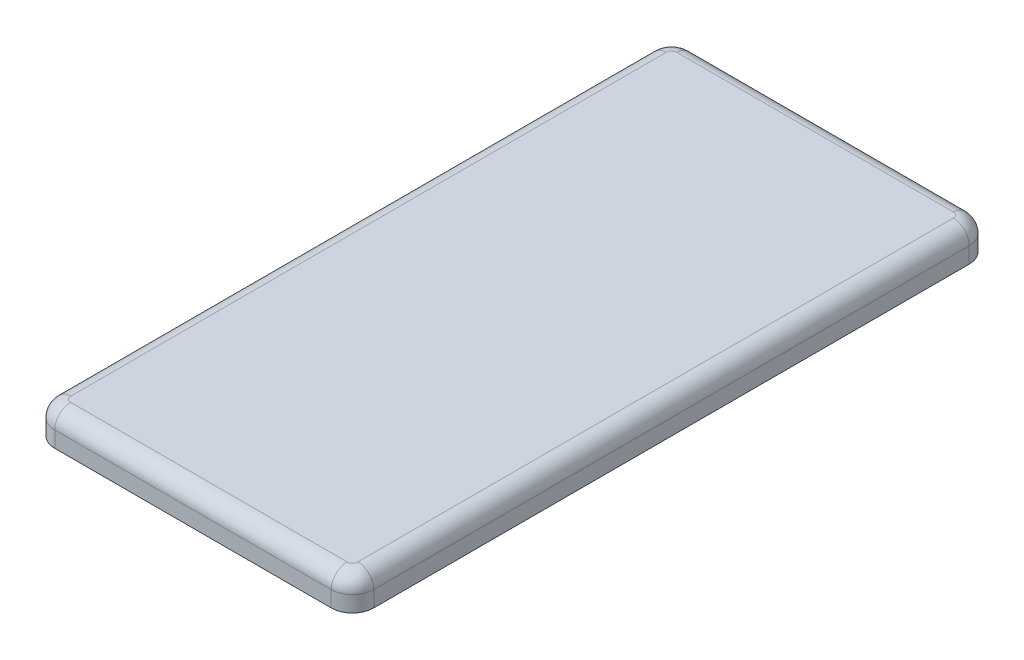
ISO-10303-21;
HEADER;
FILE_DESCRIPTION(('STEP AP214'),'2;1');
FILE_NAME('part.step','',(''),(''),'','','');
FILE_SCHEMA(('AUTOMOTIVE_DESIGN { 1 0 10303 214 1 1 1 1 }'));
ENDSEC;
DATA;
#1=APPLICATION_CONTEXT('core data for automotive mechanical design processes');
#2=APPLICATION_PROTOCOL_DEFINITION('international standard','automotive_design',2000,#1);
#3=PRODUCT_CONTEXT('',#1,'mechanical');
#4=PRODUCT('Part','Part','',(#3));
#5=PRODUCT_RELATED_PRODUCT_CATEGORY('part','',(#4));
#6=PRODUCT_DEFINITION_FORMATION('','',#4);
#7=PRODUCT_DEFINITION_CONTEXT('part definition',#1,'design');
#8=PRODUCT_DEFINITION('design','',#6,#7);
#9=PRODUCT_DEFINITION_SHAPE('','',#8);
#10=(LENGTH_UNIT() NAMED_UNIT(*) SI_UNIT(.MILLI.,.METRE.));
#11=(NAMED_UNIT(*) PLANE_ANGLE_UNIT() SI_UNIT($,.RADIAN.));
#12=(NAMED_UNIT(*) SI_UNIT($,.STERADIAN.) SOLID_ANGLE_UNIT());
#13=UNCERTAINTY_MEASURE_WITH_UNIT(LENGTH_MEASURE(1.E-05),#10,'distance_accuracy_value','');
#14=(GEOMETRIC_REPRESENTATION_CONTEXT(3) GLOBAL_UNCERTAINTY_ASSIGNED_CONTEXT((#13)) GLOBAL_UNIT_ASSIGNED_CONTEXT((#10,
#11,#12)) REPRESENTATION_CONTEXT('',''));
#15=CARTESIAN_POINT('',(0.,0.,0.));
#16=DIRECTION('',(0.,0.,1.));
#17=DIRECTION('',(1.,0.,0.));
#18=AXIS2_PLACEMENT_3D('',#15,#16,#17);
#19=CARTESIAN_POINT('',(-13.,0.,30.));
#20=DIRECTION('',(0.,0.,1.));
#21=DIRECTION('',(1.,0.,0.));
#22=AXIS2_PLACEMENT_3D('',#19,#20,#21);
#23=PLANE('',#22);
#24=DIRECTION('',(1.,0.,0.));
#25=VECTOR('',#24,1.);
#26=CARTESIAN_POINT('',(-6.5,0.,30.));
#27=LINE('',#26,#25);
#28=CARTESIAN_POINT('',(-13.,0.,30.));
#29=VERTEX_POINT('',#28);
#30=CARTESIAN_POINT('',(13.,0.,30.));
#31=VERTEX_POINT('',#30);
#32=EDGE_CURVE('E141',#29,#31,#27,.T.);
#33=ORIENTED_EDGE('',*,*,#32,.F.);
#34=DIRECTION('',(0.,-1.,0.));
#35=VECTOR('',#34,1.);
#36=CARTESIAN_POINT('',(-13.,0.,30.));
#37=LINE('',#36,#35);
#38=CARTESIAN_POINT('',(-13.,-1.5,30.));
#39=VERTEX_POINT('',#38);
#40=EDGE_CURVE('E143',#29,#39,#37,.T.);
#41=ORIENTED_EDGE('',*,*,#40,.T.);
#42=DIRECTION('',(-1.,0.,0.));
#43=VECTOR('',#42,1.);
#44=CARTESIAN_POINT('',(-13.,-1.5,30.));
#45=LINE('',#44,#43);
#46=CARTESIAN_POINT('',(13.,-1.5,30.));
#47=VERTEX_POINT('',#46);
#48=EDGE_CURVE('E169',#47,#39,#45,.T.);
#49=ORIENTED_EDGE('',*,*,#48,.F.);
#50=DIRECTION('',(0.,1.,0.));
#51=VECTOR('',#50,1.);
#52=CARTESIAN_POINT('',(13.,0.,30.));
#53=LINE('',#52,#51);
#54=EDGE_CURVE('E10',#47,#31,#53,.T.);
#55=ORIENTED_EDGE('',*,*,#54,.T.);
#56=EDGE_LOOP('',(#33,#41,#49,#55));
#57=FACE_BOUND('',#56,.T.);
#58=ADVANCED_FACE('F16',(#57),#23,.T.);
#59=CARTESIAN_POINT('',(13.,0.,28.));
#60=DIRECTION('',(0.,-1.,0.));
#61=DIRECTION('',(0.,0.,1.));
#62=AXIS2_PLACEMENT_3D('',#59,#60,#61);
#63=CYLINDRICAL_SURFACE('',#62,2.);
#64=CARTESIAN_POINT('',(13.,0.,28.));
#65=DIRECTION('',(0.,1.,0.));
#66=DIRECTION('',(0.707106781186548,0.,0.707106781186548));
#67=AXIS2_PLACEMENT_3D('',#64,#65,#66);
#68=CIRCLE('',#67,2.);
#69=CARTESIAN_POINT('',(15.,0.,28.));
#70=VERTEX_POINT('',#69);
#71=EDGE_CURVE('E117',#31,#70,#68,.T.);
#72=ORIENTED_EDGE('',*,*,#71,.F.);
#73=ORIENTED_EDGE('',*,*,#54,.F.);
#74=CARTESIAN_POINT('',(13.,-1.5,28.));
#75=DIRECTION('',(0.,-1.,0.));
#76=DIRECTION('',(0.,0.,1.));
#77=AXIS2_PLACEMENT_3D('',#74,#75,#76);
#78=CIRCLE('',#77,2.);
#79=CARTESIAN_POINT('',(15.,-1.5,28.));
#80=VERTEX_POINT('',#79);
#81=EDGE_CURVE('E187',#80,#47,#78,.T.);
#82=ORIENTED_EDGE('',*,*,#81,.F.);
#83=DIRECTION('',(0.,1.,0.));
#84=VECTOR('',#83,1.);
#85=CARTESIAN_POINT('',(15.,0.,28.));
#86=LINE('',#85,#84);
#87=EDGE_CURVE('E27',#80,#70,#86,.T.);
#88=ORIENTED_EDGE('',*,*,#87,.T.);
#89=EDGE_LOOP('',(#72,#73,#82,#88));
#90=FACE_BOUND('',#89,.T.);
#91=ADVANCED_FACE('F244',(#90),#63,.T.);
#92=CARTESIAN_POINT('',(15.,0.,28.));
#93=DIRECTION('',(1.,0.,0.));
#94=DIRECTION('',(0.,0.,-1.));
#95=AXIS2_PLACEMENT_3D('',#92,#93,#94);
#96=PLANE('',#95);
#97=DIRECTION('',(0.,0.,-1.));
#98=VECTOR('',#97,1.);
#99=CARTESIAN_POINT('',(15.,0.,14.));
#100=LINE('',#99,#98);
#101=CARTESIAN_POINT('',(15.,0.,-28.));
#102=VERTEX_POINT('',#101);
#103=EDGE_CURVE('E116',#70,#102,#100,.T.);
#104=ORIENTED_EDGE('',*,*,#103,.F.);
#105=ORIENTED_EDGE('',*,*,#87,.F.);
#106=DIRECTION('',(0.,0.,1.));
#107=VECTOR('',#106,1.);
#108=CARTESIAN_POINT('',(15.,-1.5,28.));
#109=LINE('',#108,#107);
#110=CARTESIAN_POINT('',(15.,-1.5,-28.));
#111=VERTEX_POINT('',#110);
#112=EDGE_CURVE('E168',#111,#80,#109,.T.);
#113=ORIENTED_EDGE('',*,*,#112,.F.);
#114=DIRECTION('',(0.,1.,0.));
#115=VECTOR('',#114,1.);
#116=CARTESIAN_POINT('',(15.,0.,-28.));
#117=LINE('',#116,#115);
#118=EDGE_CURVE('E194',#111,#102,#117,.T.);
#119=ORIENTED_EDGE('',*,*,#118,.T.);
#120=EDGE_LOOP('',(#104,#105,#113,#119));
#121=FACE_BOUND('',#120,.T.);
#122=ADVANCED_FACE('F291',(#121),#96,.T.);
#123=CARTESIAN_POINT('',(-13.,0.,28.));
#124=DIRECTION('',(0.,-1.,0.));
#125=DIRECTION('',(-1.,0.,0.));
#126=AXIS2_PLACEMENT_3D('',#123,#124,#125);
#127=CYLINDRICAL_SURFACE('',#126,2.);
#128=CARTESIAN_POINT('',(-13.,0.,28.));
#129=DIRECTION('',(0.,1.,0.));
#130=DIRECTION('',(-0.707106781186548,0.,0.707106781186548));
#131=AXIS2_PLACEMENT_3D('',#128,#129,#130);
#132=CIRCLE('',#131,2.);
#133=CARTESIAN_POINT('',(-15.,0.,28.));
#134=VERTEX_POINT('',#133);
#135=EDGE_CURVE('E184',#134,#29,#132,.T.);
#136=ORIENTED_EDGE('',*,*,#135,.F.);
#137=DIRECTION('',(0.,1.,0.));
#138=VECTOR('',#137,1.);
#139=CARTESIAN_POINT('',(-15.,0.,28.));
#140=LINE('',#139,#138);
#141=CARTESIAN_POINT('',(-15.,-1.5,28.));
#142=VERTEX_POINT('',#141);
#143=EDGE_CURVE('E136',#142,#134,#140,.T.);
#144=ORIENTED_EDGE('',*,*,#143,.F.);
#145=CARTESIAN_POINT('',(-13.,-1.5,28.));
#146=DIRECTION('',(0.,-1.,0.));
#147=DIRECTION('',(-1.,0.,0.));
#148=AXIS2_PLACEMENT_3D('',#145,#146,#147);
#149=CIRCLE('',#148,2.);
#150=EDGE_CURVE('E68',#39,#142,#149,.T.);
#151=ORIENTED_EDGE('',*,*,#150,.F.);
#152=ORIENTED_EDGE('',*,*,#40,.F.);
#153=EDGE_LOOP('',(#136,#144,#151,#152));
#154=FACE_BOUND('',#153,.T.);
#155=ADVANCED_FACE('F239',(#154),#127,.T.);
#156=CARTESIAN_POINT('',(0.,-1.5,0.));
#157=DIRECTION('',(0.,-1.,0.));
#158=DIRECTION('',(0.,0.,-1.));
#159=AXIS2_PLACEMENT_3D('',#156,#157,#158);
#160=PLANE('',#159);
#161=ORIENTED_EDGE('',*,*,#48,.T.);
#162=ORIENTED_EDGE('',*,*,#150,.T.);
#163=DIRECTION('',(0.,0.,-1.));
#164=VECTOR('',#163,1.);
#165=CARTESIAN_POINT('',(-15.,-1.5,-28.));
#166=LINE('',#165,#164);
#167=CARTESIAN_POINT('',(-15.,-1.5,-28.));
#168=VERTEX_POINT('',#167);
#169=EDGE_CURVE('E145',#142,#168,#166,.T.);
#170=ORIENTED_EDGE('',*,*,#169,.T.);
#171=CARTESIAN_POINT('',(-13.,-1.5,-28.));
#172=DIRECTION('',(0.,-1.,0.));
#173=DIRECTION('',(0.,0.,-1.));
#174=AXIS2_PLACEMENT_3D('',#171,#172,#173);
#175=CIRCLE('',#174,2.);
#176=CARTESIAN_POINT('',(-13.,-1.5,-30.));
#177=VERTEX_POINT('',#176);
#178=EDGE_CURVE('E78',#168,#177,#175,.T.);
#179=ORIENTED_EDGE('',*,*,#178,.T.);
#180=DIRECTION('',(1.,0.,0.));
#181=VECTOR('',#180,1.);
#182=CARTESIAN_POINT('',(13.,-1.5,-30.));
#183=LINE('',#182,#181);
#184=CARTESIAN_POINT('',(13.,-1.5,-30.));
#185=VERTEX_POINT('',#184);
#186=EDGE_CURVE('E197',#177,#185,#183,.T.);
#187=ORIENTED_EDGE('',*,*,#186,.T.);
#188=CARTESIAN_POINT('',(13.,-1.5,-28.));
#189=DIRECTION('',(0.,-1.,0.));
#190=DIRECTION('',(1.,0.,0.));
#191=AXIS2_PLACEMENT_3D('',#188,#189,#190);
#192=CIRCLE('',#191,2.);
#193=EDGE_CURVE('E196',#185,#111,#192,.T.);
#194=ORIENTED_EDGE('',*,*,#193,.T.);
#195=ORIENTED_EDGE('',*,*,#112,.T.);
#196=ORIENTED_EDGE('',*,*,#81,.T.);
#197=EDGE_LOOP('',(#161,#162,#170,#179,#187,#194,#195,#196));
#198=FACE_BOUND('',#197,.T.);
#199=ADVANCED_FACE('F241',(#198),#160,.T.);
#200=CARTESIAN_POINT('',(0.,1.5,0.));
#201=DIRECTION('',(0.,-1.,0.));
#202=DIRECTION('',(0.,0.,-1.));
#203=AXIS2_PLACEMENT_3D('',#200,#201,#202);
#204=PLANE('',#203);
#205=CARTESIAN_POINT('',(13.,1.5,-28.));
#206=DIRECTION('',(0.,-1.,0.));
#207=DIRECTION('',(0.707106781186547,0.,-0.707106781186548));
#208=AXIS2_PLACEMENT_3D('',#205,#206,#207);
#209=CIRCLE('',#208,0.500000000000006);
#210=CARTESIAN_POINT('',(13.,1.5,-28.5));
#211=VERTEX_POINT('',#210);
#212=CARTESIAN_POINT('',(13.5,1.5,-28.));
#213=VERTEX_POINT('',#212);
#214=EDGE_CURVE('E108',#211,#213,#209,.T.);
#215=ORIENTED_EDGE('',*,*,#214,.F.);
#216=DIRECTION('',(1.,0.,0.));
#217=VECTOR('',#216,1.);
#218=CARTESIAN_POINT('',(6.5,1.5,-28.5));
#219=LINE('',#218,#217);
#220=CARTESIAN_POINT('',(-13.,1.5,-28.5));
#221=VERTEX_POINT('',#220);
#222=EDGE_CURVE('E153',#221,#211,#219,.T.);
#223=ORIENTED_EDGE('',*,*,#222,.F.);
#224=CARTESIAN_POINT('',(-13.,1.5,-28.));
#225=DIRECTION('',(0.,-1.,0.));
#226=DIRECTION('',(-0.707106781186548,0.,-0.707106781186547));
#227=AXIS2_PLACEMENT_3D('',#224,#225,#226);
#228=CIRCLE('',#227,0.500000000000006);
#229=CARTESIAN_POINT('',(-13.5,1.5,-28.));
#230=VERTEX_POINT('',#229);
#231=EDGE_CURVE('E180',#230,#221,#228,.T.);
#232=ORIENTED_EDGE('',*,*,#231,.F.);
#233=DIRECTION('',(0.,0.,-1.));
#234=VECTOR('',#233,1.);
#235=CARTESIAN_POINT('',(-13.5,1.5,-14.));
#236=LINE('',#235,#234);
#237=CARTESIAN_POINT('',(-13.5,1.5,28.));
#238=VERTEX_POINT('',#237);
#239=EDGE_CURVE('E160',#238,#230,#236,.T.);
#240=ORIENTED_EDGE('',*,*,#239,.F.);
#241=CARTESIAN_POINT('',(-13.,1.5,28.));
#242=DIRECTION('',(0.,-1.,0.));
#243=DIRECTION('',(-0.707106781186548,0.,0.707106781186548));
#244=AXIS2_PLACEMENT_3D('',#241,#242,#243);
#245=CIRCLE('',#244,0.5);
#246=CARTESIAN_POINT('',(-13.,1.5,28.5));
#247=VERTEX_POINT('',#246);
#248=EDGE_CURVE('E181',#247,#238,#245,.T.);
#249=ORIENTED_EDGE('',*,*,#248,.F.);
#250=DIRECTION('',(-1.,0.,0.));
#251=VECTOR('',#250,1.);
#252=CARTESIAN_POINT('',(-6.5,1.5,28.5));
#253=LINE('',#252,#251);
#254=CARTESIAN_POINT('',(13.,1.5,28.5));
#255=VERTEX_POINT('',#254);
#256=EDGE_CURVE('E20',#255,#247,#253,.T.);
#257=ORIENTED_EDGE('',*,*,#256,.F.);
#258=CARTESIAN_POINT('',(13.,1.5,28.));
#259=DIRECTION('',(0.,-1.,0.));
#260=DIRECTION('',(0.707106781186548,0.,0.707106781186548));
#261=AXIS2_PLACEMENT_3D('',#258,#259,#260);
#262=CIRCLE('',#261,0.5);
#263=CARTESIAN_POINT('',(13.5,1.5,28.));
#264=VERTEX_POINT('',#263);
#265=EDGE_CURVE('E111',#264,#255,#262,.T.);
#266=ORIENTED_EDGE('',*,*,#265,.F.);
#267=DIRECTION('',(0.,0.,1.));
#268=VECTOR('',#267,1.);
#269=CARTESIAN_POINT('',(13.5,1.5,14.));
#270=LINE('',#269,#268);
#271=EDGE_CURVE('E104',#213,#264,#270,.T.);
#272=ORIENTED_EDGE('',*,*,#271,.F.);
#273=EDGE_LOOP('',(#215,#223,#232,#240,#249,#257,#266,#272));
#274=FACE_BOUND('',#273,.T.);
#275=ADVANCED_FACE('F106',(#274),#204,.F.);
#276=CARTESIAN_POINT('',(13.,0.,-28.));
#277=DIRECTION('',(0.,-1.,0.));
#278=DIRECTION('',(1.,0.,0.));
#279=AXIS2_PLACEMENT_3D('',#276,#277,#278);
#280=CYLINDRICAL_SURFACE('',#279,2.);
#281=CARTESIAN_POINT('',(13.,0.,-28.));
#282=DIRECTION('',(0.,1.,0.));
#283=DIRECTION('',(0.707106781186547,0.,-0.707106781186548));
#284=AXIS2_PLACEMENT_3D('',#281,#282,#283);
#285=CIRCLE('',#284,2.);
#286=CARTESIAN_POINT('',(13.,0.,-30.));
#287=VERTEX_POINT('',#286);
#288=EDGE_CURVE('E131',#102,#287,#285,.T.);
#289=ORIENTED_EDGE('',*,*,#288,.F.);
#290=ORIENTED_EDGE('',*,*,#118,.F.);
#291=ORIENTED_EDGE('',*,*,#193,.F.);
#292=DIRECTION('',(0.,1.,0.));
#293=VECTOR('',#292,1.);
#294=CARTESIAN_POINT('',(13.,0.,-30.));
#295=LINE('',#294,#293);
#296=EDGE_CURVE('E201',#185,#287,#295,.T.);
#297=ORIENTED_EDGE('',*,*,#296,.T.);
#298=EDGE_LOOP('',(#289,#290,#291,#297));
#299=FACE_BOUND('',#298,.T.);
#300=ADVANCED_FACE('F268',(#299),#280,.T.);
#301=CARTESIAN_POINT('',(13.,0.,-30.));
#302=DIRECTION('',(0.,0.,-1.));
#303=DIRECTION('',(-1.,0.,0.));
#304=AXIS2_PLACEMENT_3D('',#301,#302,#303);
#305=PLANE('',#304);
#306=DIRECTION('',(-1.,0.,0.));
#307=VECTOR('',#306,1.);
#308=CARTESIAN_POINT('',(6.5,0.,-30.));
#309=LINE('',#308,#307);
#310=CARTESIAN_POINT('',(-13.,0.,-30.));
#311=VERTEX_POINT('',#310);
#312=EDGE_CURVE('E149',#287,#311,#309,.T.);
#313=ORIENTED_EDGE('',*,*,#312,.F.);
#314=ORIENTED_EDGE('',*,*,#296,.F.);
#315=ORIENTED_EDGE('',*,*,#186,.F.);
#316=DIRECTION('',(0.,1.,0.));
#317=VECTOR('',#316,1.);
#318=CARTESIAN_POINT('',(-13.,0.,-30.));
#319=LINE('',#318,#317);
#320=EDGE_CURVE('E202',#177,#311,#319,.T.);
#321=ORIENTED_EDGE('',*,*,#320,.T.);
#322=EDGE_LOOP('',(#313,#314,#315,#321));
#323=FACE_BOUND('',#322,.T.);
#324=ADVANCED_FACE('F266',(#323),#305,.T.);
#325=CARTESIAN_POINT('',(-13.,0.,-28.));
#326=DIRECTION('',(0.,-1.,0.));
#327=DIRECTION('',(0.,0.,-1.));
#328=AXIS2_PLACEMENT_3D('',#325,#326,#327);
#329=CYLINDRICAL_SURFACE('',#328,2.);
#330=CARTESIAN_POINT('',(-13.,0.,-28.));
#331=DIRECTION('',(0.,1.,0.));
#332=DIRECTION('',(-0.707106781186548,0.,-0.707106781186547));
#333=AXIS2_PLACEMENT_3D('',#330,#331,#332);
#334=CIRCLE('',#333,2.);
#335=CARTESIAN_POINT('',(-15.,0.,-28.));
#336=VERTEX_POINT('',#335);
#337=EDGE_CURVE('E166',#311,#336,#334,.T.);
#338=ORIENTED_EDGE('',*,*,#337,.F.);
#339=ORIENTED_EDGE('',*,*,#320,.F.);
#340=ORIENTED_EDGE('',*,*,#178,.F.);
#341=DIRECTION('',(0.,1.,0.));
#342=VECTOR('',#341,1.);
#343=CARTESIAN_POINT('',(-15.,0.,-28.));
#344=LINE('',#343,#342);
#345=EDGE_CURVE('E147',#168,#336,#344,.T.);
#346=ORIENTED_EDGE('',*,*,#345,.T.);
#347=EDGE_LOOP('',(#338,#339,#340,#346));
#348=FACE_BOUND('',#347,.T.);
#349=ADVANCED_FACE('F270',(#348),#329,.T.);
#350=CARTESIAN_POINT('',(-15.,0.,-28.));
#351=DIRECTION('',(-1.,0.,0.));
#352=DIRECTION('',(0.,0.,1.));
#353=AXIS2_PLACEMENT_3D('',#350,#351,#352);
#354=PLANE('',#353);
#355=DIRECTION('',(0.,0.,1.));
#356=VECTOR('',#355,1.);
#357=CARTESIAN_POINT('',(-15.,0.,-14.));
#358=LINE('',#357,#356);
#359=EDGE_CURVE('E156',#336,#134,#358,.T.);
#360=ORIENTED_EDGE('',*,*,#359,.F.);
#361=ORIENTED_EDGE('',*,*,#345,.F.);
#362=ORIENTED_EDGE('',*,*,#169,.F.);
#363=ORIENTED_EDGE('',*,*,#143,.T.);
#364=EDGE_LOOP('',(#360,#361,#362,#363));
#365=FACE_BOUND('',#364,.T.);
#366=ADVANCED_FACE('F296',(#365),#354,.T.);
#367=CARTESIAN_POINT('',(13.5,0.,14.));
#368=DIRECTION('',(0.,0.,1.));
#369=DIRECTION('',(0.707106781186547,0.707106781186548,0.));
#370=AXIS2_PLACEMENT_3D('',#367,#368,#369);
#371=CYLINDRICAL_SURFACE('',#370,1.5);
#372=CARTESIAN_POINT('',(13.5,0.,-28.));
#373=DIRECTION('',(0.,0.,-1.));
#374=DIRECTION('',(0.,1.,0.));
#375=AXIS2_PLACEMENT_3D('',#372,#373,#374);
#376=CIRCLE('',#375,1.5);
#377=EDGE_CURVE('E123',#213,#102,#376,.T.);
#378=ORIENTED_EDGE('',*,*,#377,.F.);
#379=ORIENTED_EDGE('',*,*,#271,.T.);
#380=CARTESIAN_POINT('',(13.5,0.,28.));
#381=DIRECTION('',(0.,0.,1.));
#382=DIRECTION('',(1.,0.,0.));
#383=AXIS2_PLACEMENT_3D('',#380,#381,#382);
#384=CIRCLE('',#383,1.5);
#385=EDGE_CURVE('E139',#70,#264,#384,.T.);
#386=ORIENTED_EDGE('',*,*,#385,.F.);
#387=ORIENTED_EDGE('',*,*,#103,.T.);
#388=EDGE_LOOP('',(#378,#379,#386,#387));
#389=FACE_BOUND('',#388,.T.);
#390=ADVANCED_FACE('F129',(#389),#371,.T.);
#391=CARTESIAN_POINT('',(13.,0.,28.));
#392=DIRECTION('',(0.,1.,0.));
#393=DIRECTION('',(0.,0.,1.));
#394=AXIS2_PLACEMENT_3D('',#391,#392,#393);
#395=DEGENERATE_TOROIDAL_SURFACE('',#394,0.5,1.5,.T.);
#396=ORIENTED_EDGE('',*,*,#385,.T.);
#397=ORIENTED_EDGE('',*,*,#265,.T.);
#398=CARTESIAN_POINT('',(13.,0.,28.5));
#399=DIRECTION('',(-1.,0.,0.));
#400=DIRECTION('',(0.,0.,1.));
#401=AXIS2_PLACEMENT_3D('',#398,#399,#400);
#402=CIRCLE('',#401,1.5);
#403=EDGE_CURVE('E209',#31,#255,#402,.T.);
#404=ORIENTED_EDGE('',*,*,#403,.F.);
#405=ORIENTED_EDGE('',*,*,#71,.T.);
#406=EDGE_LOOP('',(#396,#397,#404,#405));
#407=FACE_BOUND('',#406,.T.);
#408=ADVANCED_FACE('F251',(#407),#395,.T.);
#409=CARTESIAN_POINT('',(-6.5,0.,28.5));
#410=DIRECTION('',(-1.,0.,0.));
#411=DIRECTION('',(0.,0.707106781186549,0.707106781186546));
#412=AXIS2_PLACEMENT_3D('',#409,#410,#411);
#413=CYLINDRICAL_SURFACE('',#412,1.5);
#414=ORIENTED_EDGE('',*,*,#403,.T.);
#415=ORIENTED_EDGE('',*,*,#256,.T.);
#416=CARTESIAN_POINT('',(-13.,0.,28.5));
#417=DIRECTION('',(-1.,0.,0.));
#418=DIRECTION('',(0.,0.,1.));
#419=AXIS2_PLACEMENT_3D('',#416,#417,#418);
#420=CIRCLE('',#419,1.5);
#421=EDGE_CURVE('E159',#29,#247,#420,.T.);
#422=ORIENTED_EDGE('',*,*,#421,.F.);
#423=ORIENTED_EDGE('',*,*,#32,.T.);
#424=EDGE_LOOP('',(#414,#415,#422,#423));
#425=FACE_BOUND('',#424,.T.);
#426=ADVANCED_FACE('F249',(#425),#413,.T.);
#427=CARTESIAN_POINT('',(-13.,0.,28.));
#428=DIRECTION('',(0.,1.,0.));
#429=DIRECTION('',(0.,0.,1.));
#430=AXIS2_PLACEMENT_3D('',#427,#428,#429);
#431=DEGENERATE_TOROIDAL_SURFACE('',#430,0.5,1.5,.T.);
#432=ORIENTED_EDGE('',*,*,#421,.T.);
#433=ORIENTED_EDGE('',*,*,#248,.T.);
#434=CARTESIAN_POINT('',(-13.5,0.,28.));
#435=DIRECTION('',(0.,0.,-1.));
#436=DIRECTION('',(-1.,0.,0.));
#437=AXIS2_PLACEMENT_3D('',#434,#435,#436);
#438=CIRCLE('',#437,1.5);
#439=EDGE_CURVE('E163',#134,#238,#438,.T.);
#440=ORIENTED_EDGE('',*,*,#439,.F.);
#441=ORIENTED_EDGE('',*,*,#135,.T.);
#442=EDGE_LOOP('',(#432,#433,#440,#441));
#443=FACE_BOUND('',#442,.T.);
#444=ADVANCED_FACE('F275',(#443),#431,.T.);
#445=CARTESIAN_POINT('',(-13.5,0.,-14.));
#446=DIRECTION('',(0.,0.,-1.));
#447=DIRECTION('',(-0.707106781186547,0.707106781186548,0.));
#448=AXIS2_PLACEMENT_3D('',#445,#446,#447);
#449=CYLINDRICAL_SURFACE('',#448,1.5);
#450=ORIENTED_EDGE('',*,*,#439,.T.);
#451=ORIENTED_EDGE('',*,*,#239,.T.);
#452=CARTESIAN_POINT('',(-13.5,0.,-28.));
#453=DIRECTION('',(0.,0.,-1.));
#454=DIRECTION('',(-1.,0.,0.));
#455=AXIS2_PLACEMENT_3D('',#452,#453,#454);
#456=CIRCLE('',#455,1.5);
#457=EDGE_CURVE('E152',#336,#230,#456,.T.);
#458=ORIENTED_EDGE('',*,*,#457,.F.);
#459=ORIENTED_EDGE('',*,*,#359,.T.);
#460=EDGE_LOOP('',(#450,#451,#458,#459));
#461=FACE_BOUND('',#460,.T.);
#462=ADVANCED_FACE('F272',(#461),#449,.T.);
#463=CARTESIAN_POINT('',(-13.,0.,-28.));
#464=DIRECTION('',(0.,1.,0.));
#465=DIRECTION('',(0.,0.,1.));
#466=AXIS2_PLACEMENT_3D('',#463,#464,#465);
#467=DEGENERATE_TOROIDAL_SURFACE('',#466,0.500000000000006,1.5,.T.);
#468=ORIENTED_EDGE('',*,*,#457,.T.);
#469=ORIENTED_EDGE('',*,*,#231,.T.);
#470=CARTESIAN_POINT('',(-13.,0.,-28.5));
#471=DIRECTION('',(1.,0.,0.));
#472=DIRECTION('',(0.,0.,-1.));
#473=AXIS2_PLACEMENT_3D('',#470,#471,#472);
#474=CIRCLE('',#473,1.5);
#475=EDGE_CURVE('E126',#311,#221,#474,.T.);
#476=ORIENTED_EDGE('',*,*,#475,.F.);
#477=ORIENTED_EDGE('',*,*,#337,.T.);
#478=EDGE_LOOP('',(#468,#469,#476,#477));
#479=FACE_BOUND('',#478,.T.);
#480=ADVANCED_FACE('F262',(#479),#467,.T.);
#481=CARTESIAN_POINT('',(6.5,0.,-28.5));
#482=DIRECTION('',(1.,0.,0.));
#483=DIRECTION('',(0.,0.707106781186549,-0.707106781186546));
#484=AXIS2_PLACEMENT_3D('',#481,#482,#483);
#485=CYLINDRICAL_SURFACE('',#484,1.5);
#486=ORIENTED_EDGE('',*,*,#475,.T.);
#487=ORIENTED_EDGE('',*,*,#222,.T.);
#488=CARTESIAN_POINT('',(13.,0.,-28.5));
#489=DIRECTION('',(1.,0.,0.));
#490=DIRECTION('',(0.,0.,-1.));
#491=AXIS2_PLACEMENT_3D('',#488,#489,#490);
#492=CIRCLE('',#491,1.5);
#493=EDGE_CURVE('E125',#287,#211,#492,.T.);
#494=ORIENTED_EDGE('',*,*,#493,.F.);
#495=ORIENTED_EDGE('',*,*,#312,.T.);
#496=EDGE_LOOP('',(#486,#487,#494,#495));
#497=FACE_BOUND('',#496,.T.);
#498=ADVANCED_FACE('F18',(#497),#485,.T.);
#499=CARTESIAN_POINT('',(13.,0.,-28.));
#500=DIRECTION('',(0.,1.,0.));
#501=DIRECTION('',(0.,0.,1.));
#502=AXIS2_PLACEMENT_3D('',#499,#500,#501);
#503=DEGENERATE_TOROIDAL_SURFACE('',#502,0.500000000000006,1.5,.T.);
#504=ORIENTED_EDGE('',*,*,#377,.T.);
#505=ORIENTED_EDGE('',*,*,#288,.T.);
#506=ORIENTED_EDGE('',*,*,#493,.T.);
#507=ORIENTED_EDGE('',*,*,#214,.T.);
#508=EDGE_LOOP('',(#504,#505,#506,#507));
#509=FACE_BOUND('',#508,.T.);
#510=ADVANCED_FACE('F121',(#509),#503,.T.);
#511=CLOSED_SHELL('',(#58,#91,#122,#155,#199,#275,#300,#324,#349,#366,#390,#408,#426,#444,#462,
#480,#498,#510));
#512=MANIFOLD_SOLID_BREP('B1',#511);
#513=ADVANCED_BREP_SHAPE_REPRESENTATION('',(#18,#512),#14);
#514=SHAPE_DEFINITION_REPRESENTATION(#9,#513);
ENDSEC;
END-ISO-10303-21;
